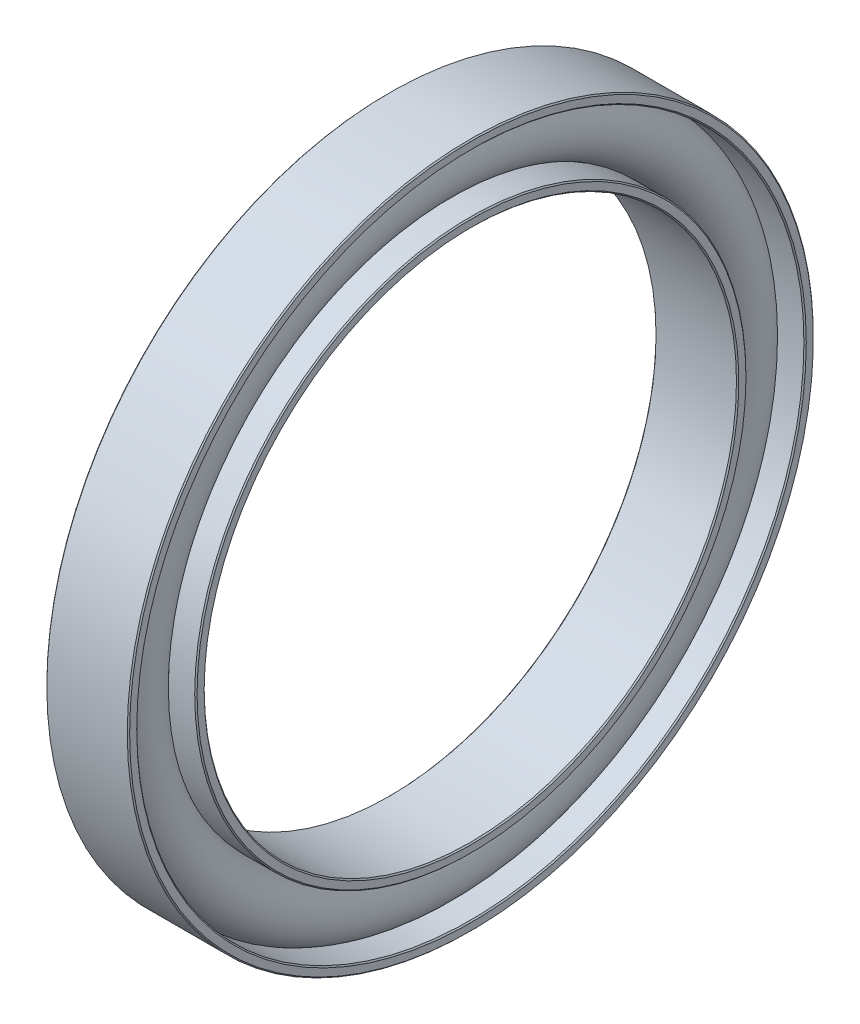
ISO-10303-21;
HEADER;
FILE_DESCRIPTION(('STEP AP214'),'2;1');
FILE_NAME('part.step','',(''),(''),'','','');
FILE_SCHEMA(('AUTOMOTIVE_DESIGN { 1 0 10303 214 1 1 1 1 }'));
ENDSEC;
DATA;
#1=APPLICATION_CONTEXT('core data for automotive mechanical design processes');
#2=APPLICATION_PROTOCOL_DEFINITION('international standard','automotive_design',2000,#1);
#3=PRODUCT_CONTEXT('',#1,'mechanical');
#4=PRODUCT('Part','Part','',(#3));
#5=PRODUCT_RELATED_PRODUCT_CATEGORY('part','',(#4));
#6=PRODUCT_DEFINITION_FORMATION('','',#4);
#7=PRODUCT_DEFINITION_CONTEXT('part definition',#1,'design');
#8=PRODUCT_DEFINITION('design','',#6,#7);
#9=PRODUCT_DEFINITION_SHAPE('','',#8);
#10=(LENGTH_UNIT() NAMED_UNIT(*) SI_UNIT(.MILLI.,.METRE.));
#11=(NAMED_UNIT(*) PLANE_ANGLE_UNIT() SI_UNIT($,.RADIAN.));
#12=(NAMED_UNIT(*) SI_UNIT($,.STERADIAN.) SOLID_ANGLE_UNIT());
#13=UNCERTAINTY_MEASURE_WITH_UNIT(LENGTH_MEASURE(1.E-05),#10,'distance_accuracy_value','');
#14=(GEOMETRIC_REPRESENTATION_CONTEXT(3) GLOBAL_UNCERTAINTY_ASSIGNED_CONTEXT((#13)) GLOBAL_UNIT_ASSIGNED_CONTEXT((#10,
#11,#12)) REPRESENTATION_CONTEXT('',''));
#15=CARTESIAN_POINT('',(0.,0.,0.));
#16=DIRECTION('',(0.,0.,1.));
#17=DIRECTION('',(1.,0.,0.));
#18=AXIS2_PLACEMENT_3D('',#15,#16,#17);
#19=CARTESIAN_POINT('',(3.5,0.,0.));
#20=DIRECTION('',(-1.,0.,0.));
#21=DIRECTION('',(0.,0.,1.));
#22=AXIS2_PLACEMENT_3D('',#19,#20,#21);
#23=CONICAL_SURFACE('',#22,28.9,0.785398163397427);
#24=CARTESIAN_POINT('',(3.4,0.,0.));
#25=DIRECTION('',(-1.,0.,0.));
#26=DIRECTION('',(0.,0.,1.));
#27=AXIS2_PLACEMENT_3D('',#24,#25,#26);
#28=CIRCLE('',#27,29.);
#29=CARTESIAN_POINT('',(3.4,0.,29.));
#30=VERTEX_POINT('',#29);
#31=EDGE_CURVE('E10',#30,#30,#28,.T.);
#32=ORIENTED_EDGE('',*,*,#31,.F.);
#33=EDGE_LOOP('',(#32));
#34=FACE_BOUND('',#33,.T.);
#35=CARTESIAN_POINT('',(3.5,0.,0.));
#36=DIRECTION('',(-1.,0.,0.));
#37=DIRECTION('',(0.,0.,1.));
#38=AXIS2_PLACEMENT_3D('',#35,#36,#37);
#39=CIRCLE('',#38,28.9);
#40=CARTESIAN_POINT('',(3.5,0.,28.9));
#41=VERTEX_POINT('',#40);
#42=EDGE_CURVE('E92',#41,#41,#39,.T.);
#43=ORIENTED_EDGE('',*,*,#42,.T.);
#44=EDGE_LOOP('',(#43));
#45=FACE_BOUND('',#44,.T.);
#46=ADVANCED_FACE('F28',(#34,#45),#23,.T.);
#47=CARTESIAN_POINT('',(-2.66143781210902,0.,0.));
#48=DIRECTION('',(-1.,0.,0.));
#49=DIRECTION('',(0.,0.,1.));
#50=AXIS2_PLACEMENT_3D('',#47,#48,#49);
#51=CYLINDRICAL_SURFACE('',#50,29.);
#52=CARTESIAN_POINT('',(-3.4,0.,0.));
#53=DIRECTION('',(-1.,0.,0.));
#54=DIRECTION('',(0.,0.,1.));
#55=AXIS2_PLACEMENT_3D('',#52,#53,#54);
#56=CIRCLE('',#55,29.);
#57=CARTESIAN_POINT('',(-3.4,0.,29.));
#58=VERTEX_POINT('',#57);
#59=EDGE_CURVE('E34',#58,#58,#56,.T.);
#60=ORIENTED_EDGE('',*,*,#59,.F.);
#61=EDGE_LOOP('',(#60));
#62=FACE_BOUND('',#61,.T.);
#63=ORIENTED_EDGE('',*,*,#31,.T.);
#64=EDGE_LOOP('',(#63));
#65=FACE_BOUND('',#64,.T.);
#66=ADVANCED_FACE('F201',(#62,#65),#51,.T.);
#67=CARTESIAN_POINT('',(-3.4,0.,0.));
#68=DIRECTION('',(1.,0.,0.));
#69=DIRECTION('',(0.,0.,-1.));
#70=AXIS2_PLACEMENT_3D('',#67,#68,#69);
#71=CONICAL_SURFACE('',#70,29.,0.785398163397429);
#72=CARTESIAN_POINT('',(-3.5,0.,0.));
#73=DIRECTION('',(-1.,0.,0.));
#74=DIRECTION('',(0.,0.,1.));
#75=AXIS2_PLACEMENT_3D('',#72,#73,#74);
#76=CIRCLE('',#75,28.9);
#77=CARTESIAN_POINT('',(-3.5,0.,28.9));
#78=VERTEX_POINT('',#77);
#79=EDGE_CURVE('E38',#78,#78,#76,.T.);
#80=ORIENTED_EDGE('',*,*,#79,.F.);
#81=EDGE_LOOP('',(#80));
#82=FACE_BOUND('',#81,.T.);
#83=ORIENTED_EDGE('',*,*,#59,.T.);
#84=EDGE_LOOP('',(#83));
#85=FACE_BOUND('',#84,.T.);
#86=ADVANCED_FACE('F196',(#82,#85),#71,.T.);
#87=CARTESIAN_POINT('',(-3.5,28.3,0.));
#88=DIRECTION('',(1.,0.,0.));
#89=DIRECTION('',(0.,0.,-1.));
#90=AXIS2_PLACEMENT_3D('',#87,#88,#89);
#91=PLANE('',#90);
#92=CARTESIAN_POINT('',(-3.5,0.,0.));
#93=DIRECTION('',(-1.,0.,0.));
#94=DIRECTION('',(0.,0.,1.));
#95=AXIS2_PLACEMENT_3D('',#92,#93,#94);
#96=CIRCLE('',#95,28.3);
#97=CARTESIAN_POINT('',(-3.5,0.,28.3));
#98=VERTEX_POINT('',#97);
#99=EDGE_CURVE('E42',#98,#98,#96,.T.);
#100=ORIENTED_EDGE('',*,*,#99,.F.);
#101=EDGE_LOOP('',(#100));
#102=FACE_BOUND('',#101,.T.);
#103=ORIENTED_EDGE('',*,*,#79,.T.);
#104=EDGE_LOOP('',(#103));
#105=FACE_BOUND('',#104,.T.);
#106=ADVANCED_FACE('F190',(#102,#105),#91,.F.);
#107=CARTESIAN_POINT('',(-3.5,0.,0.));
#108=DIRECTION('',(-1.,0.,0.));
#109=DIRECTION('',(0.,0.,1.));
#110=AXIS2_PLACEMENT_3D('',#107,#108,#109);
#111=CONICAL_SURFACE('',#110,28.3,0.785398163397442);
#112=CARTESIAN_POINT('',(-3.4,0.,0.));
#113=DIRECTION('',(-1.,0.,0.));
#114=DIRECTION('',(0.,0.,1.));
#115=AXIS2_PLACEMENT_3D('',#112,#113,#114);
#116=CIRCLE('',#115,28.2);
#117=CARTESIAN_POINT('',(-3.4,0.,28.2));
#118=VERTEX_POINT('',#117);
#119=EDGE_CURVE('E47',#118,#118,#116,.T.);
#120=ORIENTED_EDGE('',*,*,#119,.F.);
#121=EDGE_LOOP('',(#120));
#122=FACE_BOUND('',#121,.T.);
#123=ORIENTED_EDGE('',*,*,#99,.T.);
#124=EDGE_LOOP('',(#123));
#125=FACE_BOUND('',#124,.T.);
#126=ADVANCED_FACE('F184',(#122,#125),#111,.F.);
#127=CARTESIAN_POINT('',(-2.66143781210902,0.,0.));
#128=DIRECTION('',(-1.,0.,0.));
#129=DIRECTION('',(0.,0.,1.));
#130=AXIS2_PLACEMENT_3D('',#127,#128,#129);
#131=CYLINDRICAL_SURFACE('',#130,28.2);
#132=CARTESIAN_POINT('',(-0.75,0.,0.));
#133=DIRECTION('',(-1.,0.,0.));
#134=DIRECTION('',(0.,0.,1.));
#135=AXIS2_PLACEMENT_3D('',#132,#133,#134);
#136=CIRCLE('',#135,28.2);
#137=CARTESIAN_POINT('',(-0.75,0.,28.2));
#138=VERTEX_POINT('',#137);
#139=EDGE_CURVE('E50',#138,#138,#136,.T.);
#140=ORIENTED_EDGE('',*,*,#139,.F.);
#141=EDGE_LOOP('',(#140));
#142=FACE_BOUND('',#141,.T.);
#143=ORIENTED_EDGE('',*,*,#119,.T.);
#144=EDGE_LOOP('',(#143));
#145=FACE_BOUND('',#144,.T.);
#146=ADVANCED_FACE('F178',(#142,#145),#131,.F.);
#147=CARTESIAN_POINT('',(0.,0.,0.));
#148=DIRECTION('',(-1.,0.,0.));
#149=DIRECTION('',(0.,0.,1.));
#150=AXIS2_PLACEMENT_3D('',#147,#148,#149);
#151=TOROIDAL_SURFACE('',#150,25.75,2.56222559506379);
#152=CARTESIAN_POINT('',(-0.750000000000002,0.,0.));
#153=DIRECTION('',(-1.,0.,0.));
#154=DIRECTION('',(0.,0.,1.));
#155=AXIS2_PLACEMENT_3D('',#152,#153,#154);
#156=CIRCLE('',#155,23.3);
#157=CARTESIAN_POINT('',(-0.750000000000002,0.,23.3));
#158=VERTEX_POINT('',#157);
#159=EDGE_CURVE('E53',#158,#158,#156,.T.);
#160=ORIENTED_EDGE('',*,*,#159,.F.);
#161=EDGE_LOOP('',(#160));
#162=FACE_BOUND('',#161,.T.);
#163=ORIENTED_EDGE('',*,*,#139,.T.);
#164=EDGE_LOOP('',(#163));
#165=FACE_BOUND('',#164,.T.);
#166=ADVANCED_FACE('F172',(#162,#165),#151,.T.);
#167=CARTESIAN_POINT('',(-2.66143781210902,0.,0.));
#168=DIRECTION('',(-1.,0.,0.));
#169=DIRECTION('',(0.,0.,1.));
#170=AXIS2_PLACEMENT_3D('',#167,#168,#169);
#171=CYLINDRICAL_SURFACE('',#170,23.3);
#172=CARTESIAN_POINT('',(-3.4,0.,0.));
#173=DIRECTION('',(-1.,0.,0.));
#174=DIRECTION('',(0.,0.,1.));
#175=AXIS2_PLACEMENT_3D('',#172,#173,#174);
#176=CIRCLE('',#175,23.3);
#177=CARTESIAN_POINT('',(-3.4,0.,23.3));
#178=VERTEX_POINT('',#177);
#179=EDGE_CURVE('E56',#178,#178,#176,.T.);
#180=ORIENTED_EDGE('',*,*,#179,.F.);
#181=EDGE_LOOP('',(#180));
#182=FACE_BOUND('',#181,.T.);
#183=ORIENTED_EDGE('',*,*,#159,.T.);
#184=EDGE_LOOP('',(#183));
#185=FACE_BOUND('',#184,.T.);
#186=ADVANCED_FACE('F166',(#182,#185),#171,.T.);
#187=CARTESIAN_POINT('',(-3.4,0.,0.));
#188=DIRECTION('',(1.,0.,0.));
#189=DIRECTION('',(0.,0.,-1.));
#190=AXIS2_PLACEMENT_3D('',#187,#188,#189);
#191=CONICAL_SURFACE('',#190,23.3,0.785398163397453);
#192=CARTESIAN_POINT('',(-3.5,0.,0.));
#193=DIRECTION('',(-1.,0.,0.));
#194=DIRECTION('',(0.,0.,1.));
#195=AXIS2_PLACEMENT_3D('',#192,#193,#194);
#196=CIRCLE('',#195,23.2);
#197=CARTESIAN_POINT('',(-3.5,0.,23.2));
#198=VERTEX_POINT('',#197);
#199=EDGE_CURVE('E59',#198,#198,#196,.T.);
#200=ORIENTED_EDGE('',*,*,#199,.F.);
#201=EDGE_LOOP('',(#200));
#202=FACE_BOUND('',#201,.T.);
#203=ORIENTED_EDGE('',*,*,#179,.T.);
#204=EDGE_LOOP('',(#203));
#205=FACE_BOUND('',#204,.T.);
#206=ADVANCED_FACE('F160',(#202,#205),#191,.T.);
#207=CARTESIAN_POINT('',(-3.5,22.6,0.));
#208=DIRECTION('',(1.,0.,0.));
#209=DIRECTION('',(0.,0.,-1.));
#210=AXIS2_PLACEMENT_3D('',#207,#208,#209);
#211=PLANE('',#210);
#212=CARTESIAN_POINT('',(-3.5,0.,0.));
#213=DIRECTION('',(-1.,0.,0.));
#214=DIRECTION('',(0.,0.,1.));
#215=AXIS2_PLACEMENT_3D('',#212,#213,#214);
#216=CIRCLE('',#215,22.6);
#217=CARTESIAN_POINT('',(-3.5,0.,22.6));
#218=VERTEX_POINT('',#217);
#219=EDGE_CURVE('E62',#218,#218,#216,.T.);
#220=ORIENTED_EDGE('',*,*,#219,.F.);
#221=EDGE_LOOP('',(#220));
#222=FACE_BOUND('',#221,.T.);
#223=ORIENTED_EDGE('',*,*,#199,.T.);
#224=EDGE_LOOP('',(#223));
#225=FACE_BOUND('',#224,.T.);
#226=ADVANCED_FACE('F154',(#222,#225),#211,.F.);
#227=CARTESIAN_POINT('',(-3.5,0.,0.));
#228=DIRECTION('',(-1.,0.,0.));
#229=DIRECTION('',(0.,0.,1.));
#230=AXIS2_PLACEMENT_3D('',#227,#228,#229);
#231=CONICAL_SURFACE('',#230,22.6,0.785398163397444);
#232=CARTESIAN_POINT('',(-3.4,0.,0.));
#233=DIRECTION('',(-1.,0.,0.));
#234=DIRECTION('',(0.,0.,1.));
#235=AXIS2_PLACEMENT_3D('',#232,#233,#234);
#236=CIRCLE('',#235,22.5);
#237=CARTESIAN_POINT('',(-3.4,0.,22.5));
#238=VERTEX_POINT('',#237);
#239=EDGE_CURVE('E65',#238,#238,#236,.T.);
#240=ORIENTED_EDGE('',*,*,#239,.F.);
#241=EDGE_LOOP('',(#240));
#242=FACE_BOUND('',#241,.T.);
#243=ORIENTED_EDGE('',*,*,#219,.T.);
#244=EDGE_LOOP('',(#243));
#245=FACE_BOUND('',#244,.T.);
#246=ADVANCED_FACE('F148',(#242,#245),#231,.F.);
#247=CARTESIAN_POINT('',(-2.66143781210902,0.,0.));
#248=DIRECTION('',(-1.,0.,0.));
#249=DIRECTION('',(0.,0.,1.));
#250=AXIS2_PLACEMENT_3D('',#247,#248,#249);
#251=CYLINDRICAL_SURFACE('',#250,22.5);
#252=CARTESIAN_POINT('',(3.4,0.,0.));
#253=DIRECTION('',(-1.,0.,0.));
#254=DIRECTION('',(0.,0.,1.));
#255=AXIS2_PLACEMENT_3D('',#252,#253,#254);
#256=CIRCLE('',#255,22.5);
#257=CARTESIAN_POINT('',(3.4,0.,22.5));
#258=VERTEX_POINT('',#257);
#259=EDGE_CURVE('E68',#258,#258,#256,.T.);
#260=ORIENTED_EDGE('',*,*,#259,.F.);
#261=EDGE_LOOP('',(#260));
#262=FACE_BOUND('',#261,.T.);
#263=ORIENTED_EDGE('',*,*,#239,.T.);
#264=EDGE_LOOP('',(#263));
#265=FACE_BOUND('',#264,.T.);
#266=ADVANCED_FACE('F142',(#262,#265),#251,.F.);
#267=CARTESIAN_POINT('',(3.4,0.,0.));
#268=DIRECTION('',(1.,0.,0.));
#269=DIRECTION('',(0.,0.,-1.));
#270=AXIS2_PLACEMENT_3D('',#267,#268,#269);
#271=CONICAL_SURFACE('',#270,22.5,0.785398163397457);
#272=CARTESIAN_POINT('',(3.5,0.,0.));
#273=DIRECTION('',(-1.,0.,0.));
#274=DIRECTION('',(0.,0.,1.));
#275=AXIS2_PLACEMENT_3D('',#272,#273,#274);
#276=CIRCLE('',#275,22.6);
#277=CARTESIAN_POINT('',(3.5,0.,22.6));
#278=VERTEX_POINT('',#277);
#279=EDGE_CURVE('E71',#278,#278,#276,.T.);
#280=ORIENTED_EDGE('',*,*,#279,.F.);
#281=EDGE_LOOP('',(#280));
#282=FACE_BOUND('',#281,.T.);
#283=ORIENTED_EDGE('',*,*,#259,.T.);
#284=EDGE_LOOP('',(#283));
#285=FACE_BOUND('',#284,.T.);
#286=ADVANCED_FACE('F136',(#282,#285),#271,.F.);
#287=CARTESIAN_POINT('',(3.5,22.6,0.));
#288=DIRECTION('',(-1.,0.,0.));
#289=DIRECTION('',(0.,0.,1.));
#290=AXIS2_PLACEMENT_3D('',#287,#288,#289);
#291=PLANE('',#290);
#292=CARTESIAN_POINT('',(3.5,0.,0.));
#293=DIRECTION('',(-1.,0.,0.));
#294=DIRECTION('',(0.,0.,1.));
#295=AXIS2_PLACEMENT_3D('',#292,#293,#294);
#296=CIRCLE('',#295,23.2);
#297=CARTESIAN_POINT('',(3.5,0.,23.2));
#298=VERTEX_POINT('',#297);
#299=EDGE_CURVE('E74',#298,#298,#296,.T.);
#300=ORIENTED_EDGE('',*,*,#299,.F.);
#301=EDGE_LOOP('',(#300));
#302=FACE_BOUND('',#301,.T.);
#303=ORIENTED_EDGE('',*,*,#279,.T.);
#304=EDGE_LOOP('',(#303));
#305=FACE_BOUND('',#304,.T.);
#306=ADVANCED_FACE('F130',(#302,#305),#291,.F.);
#307=CARTESIAN_POINT('',(3.5,0.,0.));
#308=DIRECTION('',(-1.,0.,0.));
#309=DIRECTION('',(0.,0.,1.));
#310=AXIS2_PLACEMENT_3D('',#307,#308,#309);
#311=CONICAL_SURFACE('',#310,23.2,0.785398163397457);
#312=CARTESIAN_POINT('',(3.4,0.,0.));
#313=DIRECTION('',(-1.,0.,0.));
#314=DIRECTION('',(0.,0.,1.));
#315=AXIS2_PLACEMENT_3D('',#312,#313,#314);
#316=CIRCLE('',#315,23.3);
#317=CARTESIAN_POINT('',(3.4,0.,23.3));
#318=VERTEX_POINT('',#317);
#319=EDGE_CURVE('E77',#318,#318,#316,.T.);
#320=ORIENTED_EDGE('',*,*,#319,.F.);
#321=EDGE_LOOP('',(#320));
#322=FACE_BOUND('',#321,.T.);
#323=ORIENTED_EDGE('',*,*,#299,.T.);
#324=EDGE_LOOP('',(#323));
#325=FACE_BOUND('',#324,.T.);
#326=ADVANCED_FACE('F124',(#322,#325),#311,.T.);
#327=CARTESIAN_POINT('',(-2.66143781210902,0.,0.));
#328=DIRECTION('',(-1.,0.,0.));
#329=DIRECTION('',(0.,0.,1.));
#330=AXIS2_PLACEMENT_3D('',#327,#328,#329);
#331=CYLINDRICAL_SURFACE('',#330,23.3);
#332=CARTESIAN_POINT('',(0.75,0.,0.));
#333=DIRECTION('',(-1.,0.,0.));
#334=DIRECTION('',(0.,0.,1.));
#335=AXIS2_PLACEMENT_3D('',#332,#333,#334);
#336=CIRCLE('',#335,23.3);
#337=CARTESIAN_POINT('',(0.75,0.,23.3));
#338=VERTEX_POINT('',#337);
#339=EDGE_CURVE('E80',#338,#338,#336,.T.);
#340=ORIENTED_EDGE('',*,*,#339,.F.);
#341=EDGE_LOOP('',(#340));
#342=FACE_BOUND('',#341,.T.);
#343=ORIENTED_EDGE('',*,*,#319,.T.);
#344=EDGE_LOOP('',(#343));
#345=FACE_BOUND('',#344,.T.);
#346=ADVANCED_FACE('F118',(#342,#345),#331,.T.);
#347=CARTESIAN_POINT('',(0.,0.,0.));
#348=DIRECTION('',(-1.,0.,0.));
#349=DIRECTION('',(0.,0.,1.));
#350=AXIS2_PLACEMENT_3D('',#347,#348,#349);
#351=TOROIDAL_SURFACE('',#350,25.75,2.56222559506379);
#352=CARTESIAN_POINT('',(0.750000000000002,0.,0.));
#353=DIRECTION('',(-1.,0.,0.));
#354=DIRECTION('',(0.,0.,1.));
#355=AXIS2_PLACEMENT_3D('',#352,#353,#354);
#356=CIRCLE('',#355,28.2);
#357=CARTESIAN_POINT('',(0.750000000000002,0.,28.2));
#358=VERTEX_POINT('',#357);
#359=EDGE_CURVE('E83',#358,#358,#356,.T.);
#360=ORIENTED_EDGE('',*,*,#359,.F.);
#361=EDGE_LOOP('',(#360));
#362=FACE_BOUND('',#361,.T.);
#363=ORIENTED_EDGE('',*,*,#339,.T.);
#364=EDGE_LOOP('',(#363));
#365=FACE_BOUND('',#364,.T.);
#366=ADVANCED_FACE('F112',(#362,#365),#351,.T.);
#367=CARTESIAN_POINT('',(-2.66143781210902,0.,0.));
#368=DIRECTION('',(-1.,0.,0.));
#369=DIRECTION('',(0.,0.,1.));
#370=AXIS2_PLACEMENT_3D('',#367,#368,#369);
#371=CYLINDRICAL_SURFACE('',#370,28.2);
#372=CARTESIAN_POINT('',(3.4,0.,0.));
#373=DIRECTION('',(-1.,0.,0.));
#374=DIRECTION('',(0.,0.,1.));
#375=AXIS2_PLACEMENT_3D('',#372,#373,#374);
#376=CIRCLE('',#375,28.2);
#377=CARTESIAN_POINT('',(3.4,0.,28.2));
#378=VERTEX_POINT('',#377);
#379=EDGE_CURVE('E86',#378,#378,#376,.T.);
#380=ORIENTED_EDGE('',*,*,#379,.F.);
#381=EDGE_LOOP('',(#380));
#382=FACE_BOUND('',#381,.T.);
#383=ORIENTED_EDGE('',*,*,#359,.T.);
#384=EDGE_LOOP('',(#383));
#385=FACE_BOUND('',#384,.T.);
#386=ADVANCED_FACE('F106',(#382,#385),#371,.F.);
#387=CARTESIAN_POINT('',(3.4,0.,0.));
#388=DIRECTION('',(1.,0.,0.));
#389=DIRECTION('',(0.,0.,-1.));
#390=AXIS2_PLACEMENT_3D('',#387,#388,#389);
#391=CONICAL_SURFACE('',#390,28.2,0.78539816339744);
#392=CARTESIAN_POINT('',(3.5,0.,0.));
#393=DIRECTION('',(-1.,0.,0.));
#394=DIRECTION('',(0.,0.,1.));
#395=AXIS2_PLACEMENT_3D('',#392,#393,#394);
#396=CIRCLE('',#395,28.3);
#397=CARTESIAN_POINT('',(3.5,0.,28.3));
#398=VERTEX_POINT('',#397);
#399=EDGE_CURVE('E89',#398,#398,#396,.T.);
#400=ORIENTED_EDGE('',*,*,#399,.F.);
#401=EDGE_LOOP('',(#400));
#402=FACE_BOUND('',#401,.T.);
#403=ORIENTED_EDGE('',*,*,#379,.T.);
#404=EDGE_LOOP('',(#403));
#405=FACE_BOUND('',#404,.T.);
#406=ADVANCED_FACE('F100',(#402,#405),#391,.F.);
#407=CARTESIAN_POINT('',(3.5,28.3,0.));
#408=DIRECTION('',(-1.,0.,0.));
#409=DIRECTION('',(0.,0.,1.));
#410=AXIS2_PLACEMENT_3D('',#407,#408,#409);
#411=PLANE('',#410);
#412=ORIENTED_EDGE('',*,*,#42,.F.);
#413=EDGE_LOOP('',(#412));
#414=FACE_BOUND('',#413,.T.);
#415=ORIENTED_EDGE('',*,*,#399,.T.);
#416=EDGE_LOOP('',(#415));
#417=FACE_BOUND('',#416,.T.);
#418=ADVANCED_FACE('F97',(#414,#417),#411,.F.);
#419=CLOSED_SHELL('',(#46,#66,#86,#106,#126,#146,#166,#186,#206,#226,#246,#266,#286,#306,#326,
#346,#366,#386,#406,#418));
#420=MANIFOLD_SOLID_BREP('B2',#419);
#421=ADVANCED_BREP_SHAPE_REPRESENTATION('',(#18,#420),#14);
#422=SHAPE_DEFINITION_REPRESENTATION(#9,#421);
ENDSEC;
END-ISO-10303-21;
